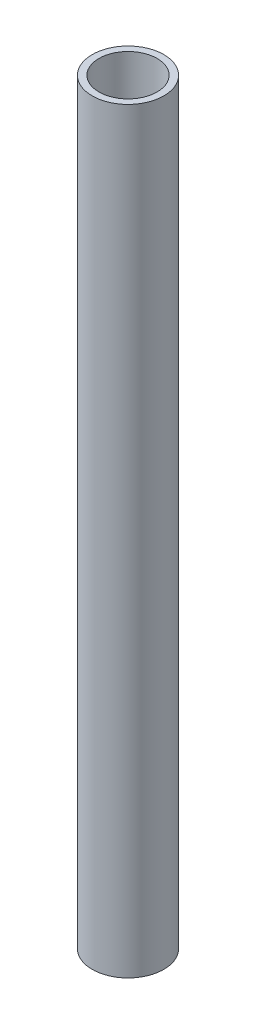
ISO-10303-21;
HEADER;
FILE_DESCRIPTION(('STEP AP214'),'2;1');
FILE_NAME('part.step','',(''),(''),'','','');
FILE_SCHEMA(('AUTOMOTIVE_DESIGN { 1 0 10303 214 1 1 1 1 }'));
ENDSEC;
DATA;
#1=APPLICATION_CONTEXT('core data for automotive mechanical design processes');
#2=APPLICATION_PROTOCOL_DEFINITION('international standard','automotive_design',2000,#1);
#3=PRODUCT_CONTEXT('',#1,'mechanical');
#4=PRODUCT('Part','Part','',(#3));
#5=PRODUCT_RELATED_PRODUCT_CATEGORY('part','',(#4));
#6=PRODUCT_DEFINITION_FORMATION('','',#4);
#7=PRODUCT_DEFINITION_CONTEXT('part definition',#1,'design');
#8=PRODUCT_DEFINITION('design','',#6,#7);
#9=PRODUCT_DEFINITION_SHAPE('','',#8);
#10=(LENGTH_UNIT() NAMED_UNIT(*) SI_UNIT(.MILLI.,.METRE.));
#11=(NAMED_UNIT(*) PLANE_ANGLE_UNIT() SI_UNIT($,.RADIAN.));
#12=(NAMED_UNIT(*) SI_UNIT($,.STERADIAN.) SOLID_ANGLE_UNIT());
#13=UNCERTAINTY_MEASURE_WITH_UNIT(LENGTH_MEASURE(1.E-05),#10,'distance_accuracy_value','');
#14=(GEOMETRIC_REPRESENTATION_CONTEXT(3) GLOBAL_UNCERTAINTY_ASSIGNED_CONTEXT((#13)) GLOBAL_UNIT_ASSIGNED_CONTEXT((#10,
#11,#12)) REPRESENTATION_CONTEXT('',''));
#15=CARTESIAN_POINT('',(0.,0.,0.));
#16=DIRECTION('',(0.,0.,1.));
#17=DIRECTION('',(1.,0.,0.));
#18=AXIS2_PLACEMENT_3D('',#15,#16,#17);
#19=CARTESIAN_POINT('',(2.44769482460327E-11,225.,1.50000000000049));
#20=DIRECTION('',(0.,1.,0.));
#21=DIRECTION('',(0.,0.,0.999999999999999));
#22=AXIS2_PLACEMENT_3D('',#19,#20,#21);
#23=PLANE('',#22);
#24=CARTESIAN_POINT('',(2.44769482460327E-11,225.,1.50000000000049));
#25=DIRECTION('',(0.,1.,0.));
#26=DIRECTION('',(0.,0.,0.999999999999999));
#27=AXIS2_PLACEMENT_3D('',#24,#25,#26);
#28=CIRCLE('',#27,10.65);
#29=CARTESIAN_POINT('',(2.44563488384369E-11,225.,-9.1499999999995));
#30=VERTEX_POINT('',#29);
#31=EDGE_CURVE('E12',#30,#30,#28,.T.);
#32=ORIENTED_EDGE('',*,*,#31,.T.);
#33=EDGE_LOOP('',(#32));
#34=FACE_BOUND('',#33,.T.);
#35=CARTESIAN_POINT('',(2.44769482460327E-11,225.,1.50000000000049));
#36=DIRECTION('',(0.,1.,0.));
#37=DIRECTION('',(0.,0.,0.999999999999999));
#38=AXIS2_PLACEMENT_3D('',#35,#36,#37);
#39=CIRCLE('',#38,8.65);
#40=CARTESIAN_POINT('',(2.44602172717883E-11,225.,-7.1499999999995));
#41=VERTEX_POINT('',#40);
#42=EDGE_CURVE('E60',#41,#41,#39,.T.);
#43=ORIENTED_EDGE('',*,*,#42,.F.);
#44=EDGE_LOOP('',(#43));
#45=FACE_BOUND('',#44,.T.);
#46=ADVANCED_FACE('F46',(#34,#45),#23,.T.);
#47=CARTESIAN_POINT('',(2.44249065417534E-11,-2.4980018054066E-13,1.49999999999982));
#48=DIRECTION('',(0.,1.,0.));
#49=DIRECTION('',(0.,0.,0.999999999999999));
#50=AXIS2_PLACEMENT_3D('',#47,#48,#49);
#51=PLANE('',#50);
#52=CARTESIAN_POINT('',(2.44249065417534E-11,-2.4980018054066E-13,1.49999999999982));
#53=DIRECTION('',(0.,1.,0.));
#54=DIRECTION('',(0.,0.,0.999999999999999));
#55=AXIS2_PLACEMENT_3D('',#52,#53,#54);
#56=CIRCLE('',#55,10.65);
#57=CARTESIAN_POINT('',(2.44024399665401E-11,-2.22044604925031E-13,-9.14999999999955));
#58=VERTEX_POINT('',#57);
#59=EDGE_CURVE('E50',#58,#58,#56,.T.);
#60=ORIENTED_EDGE('',*,*,#59,.F.);
#61=EDGE_LOOP('',(#60));
#62=FACE_BOUND('',#61,.T.);
#63=CARTESIAN_POINT('',(2.44249065417534E-11,-2.4980018054066E-13,1.49999999999982));
#64=DIRECTION('',(0.,1.,0.));
#65=DIRECTION('',(0.,0.,0.999999999999999));
#66=AXIS2_PLACEMENT_3D('',#63,#64,#65);
#67=CIRCLE('',#66,8.65);
#68=CARTESIAN_POINT('',(2.44063083998914E-11,-2.22044604925031E-13,-7.14999999999955));
#69=VERTEX_POINT('',#68);
#70=EDGE_CURVE('E62',#69,#69,#67,.T.);
#71=ORIENTED_EDGE('',*,*,#70,.T.);
#72=EDGE_LOOP('',(#71));
#73=FACE_BOUND('',#72,.T.);
#74=ADVANCED_FACE('F75',(#62,#73),#51,.F.);
#75=CARTESIAN_POINT('',(2.44769482460327E-11,225.,1.50000000000049));
#76=DIRECTION('',(0.,-1.,0.));
#77=DIRECTION('',(0.,0.,-0.999999999999999));
#78=AXIS2_PLACEMENT_3D('',#75,#76,#77);
#79=CYLINDRICAL_SURFACE('',#78,10.65);
#80=CARTESIAN_POINT('',(2.44563488384369E-11,225.,-9.1499999999995));
#81=CARTESIAN_POINT('',(2.4455787287688E-11,222.65625,-9.1499999999995));
#82=CARTESIAN_POINT('',(2.44552257369391E-11,220.3125,-9.1499999999995));
#83=CARTESIAN_POINT('',(2.44541026354412E-11,215.625,-9.1499999999995));
#84=CARTESIAN_POINT('',(2.44535410846923E-11,213.28125,-9.1499999999995));
#85=CARTESIAN_POINT('',(2.44524179831945E-11,208.59375,-9.1499999999995));
#86=CARTESIAN_POINT('',(2.44518564324455E-11,206.25,-9.1499999999995));
#87=CARTESIAN_POINT('',(2.44507333309477E-11,201.5625,-9.1499999999995));
#88=CARTESIAN_POINT('',(2.44501717801988E-11,199.21875,-9.14999999999951));
#89=CARTESIAN_POINT('',(2.44490486787009E-11,194.53125,-9.14999999999951));
#90=CARTESIAN_POINT('',(2.4448487127952E-11,192.1875,-9.14999999999951));
#91=CARTESIAN_POINT('',(2.44473640264541E-11,187.5,-9.14999999999951));
#92=CARTESIAN_POINT('',(2.44468024757052E-11,185.15625,-9.14999999999951));
#93=CARTESIAN_POINT('',(2.44456793742074E-11,180.46875,-9.14999999999951));
#94=CARTESIAN_POINT('',(2.44451178234584E-11,178.125,-9.14999999999951));
#95=CARTESIAN_POINT('',(2.44439947219606E-11,173.4375,-9.14999999999951));
#96=CARTESIAN_POINT('',(2.44434331712117E-11,171.09375,-9.14999999999951));
#97=CARTESIAN_POINT('',(2.44423100697138E-11,166.40625,-9.14999999999951));
#98=CARTESIAN_POINT('',(2.44417485189649E-11,164.0625,-9.14999999999951));
#99=CARTESIAN_POINT('',(2.4440625417467E-11,159.375,-9.14999999999951));
#100=CARTESIAN_POINT('',(2.44400638667181E-11,157.03125,-9.14999999999951));
#101=CARTESIAN_POINT('',(2.44389407652203E-11,152.34375,-9.14999999999951));
#102=CARTESIAN_POINT('',(2.44383792144713E-11,150.,-9.14999999999952));
#103=CARTESIAN_POINT('',(2.44372561129735E-11,145.3125,-9.14999999999952));
#104=CARTESIAN_POINT('',(2.44366945622246E-11,142.96875,-9.14999999999952));
#105=CARTESIAN_POINT('',(2.44355714607267E-11,138.28125,-9.14999999999952));
#106=CARTESIAN_POINT('',(2.44350099099778E-11,135.9375,-9.14999999999952));
#107=CARTESIAN_POINT('',(2.44338868084799E-11,131.25,-9.14999999999952));
#108=CARTESIAN_POINT('',(2.4433325257731E-11,128.90625,-9.14999999999952));
#109=CARTESIAN_POINT('',(2.44322021562332E-11,124.21875,-9.14999999999952));
#110=CARTESIAN_POINT('',(2.44316406054842E-11,121.875,-9.14999999999952));
#111=CARTESIAN_POINT('',(2.44305175039864E-11,117.1875,-9.14999999999952));
#112=CARTESIAN_POINT('',(2.44299559532375E-11,114.84375,-9.14999999999952));
#113=CARTESIAN_POINT('',(2.44288328517396E-11,110.15625,-9.14999999999952));
#114=CARTESIAN_POINT('',(2.44282713009907E-11,107.8125,-9.14999999999952));
#115=CARTESIAN_POINT('',(2.44271481994928E-11,103.125,-9.14999999999952));
#116=CARTESIAN_POINT('',(2.44265866487439E-11,100.78125,-9.14999999999953));
#117=CARTESIAN_POINT('',(2.44254635472461E-11,96.0937499999997,-9.14999999999953));
#118=CARTESIAN_POINT('',(2.44249019964971E-11,93.7499999999997,-9.14999999999953));
#119=CARTESIAN_POINT('',(2.44237788949993E-11,89.0624999999997,-9.14999999999953));
#120=CARTESIAN_POINT('',(2.44232173442503E-11,86.7187499999997,-9.14999999999953));
#121=CARTESIAN_POINT('',(2.44220942427525E-11,82.0312499999997,-9.14999999999953));
#122=CARTESIAN_POINT('',(2.44215326920036E-11,79.6874999999997,-9.14999999999953));
#123=CARTESIAN_POINT('',(2.44204095905057E-11,74.9999999999997,-9.14999999999953));
#124=CARTESIAN_POINT('',(2.44198480397568E-11,72.6562499999997,-9.14999999999953));
#125=CARTESIAN_POINT('',(2.44187249382589E-11,67.9687499999997,-9.14999999999953));
#126=CARTESIAN_POINT('',(2.441816338751E-11,65.6249999999997,-9.14999999999953));
#127=CARTESIAN_POINT('',(2.44170402860122E-11,60.9374999999997,-9.14999999999953));
#128=CARTESIAN_POINT('',(2.44164787352632E-11,58.5937499999997,-9.14999999999954));
#129=CARTESIAN_POINT('',(2.44153556337654E-11,53.9062499999997,-9.14999999999954));
#130=CARTESIAN_POINT('',(2.44147940830165E-11,51.5624999999998,-9.14999999999954));
#131=CARTESIAN_POINT('',(2.44136709815186E-11,46.8749999999998,-9.14999999999954));
#132=CARTESIAN_POINT('',(2.44131094307697E-11,44.5312499999998,-9.14999999999954));
#133=CARTESIAN_POINT('',(2.44119863292718E-11,39.8437499999998,-9.14999999999954));
#134=CARTESIAN_POINT('',(2.44114247785229E-11,37.4999999999998,-9.14999999999954));
#135=CARTESIAN_POINT('',(2.44103016770251E-11,32.8124999999998,-9.14999999999954));
#136=CARTESIAN_POINT('',(2.44097401262761E-11,30.4687499999998,-9.14999999999954));
#137=CARTESIAN_POINT('',(2.44086170247783E-11,25.7812499999998,-9.14999999999954));
#138=CARTESIAN_POINT('',(2.44080554740294E-11,23.4374999999998,-9.14999999999954));
#139=CARTESIAN_POINT('',(2.44069323725315E-11,18.7499999999998,-9.14999999999954));
#140=CARTESIAN_POINT('',(2.44063708217826E-11,16.4062499999998,-9.14999999999955));
#141=CARTESIAN_POINT('',(2.44052477202847E-11,11.7187499999998,-9.14999999999955));
#142=CARTESIAN_POINT('',(2.44046861695358E-11,9.37499999999976,-9.14999999999955));
#143=CARTESIAN_POINT('',(2.4403563068038E-11,4.68749999999977,-9.14999999999955));
#144=CARTESIAN_POINT('',(2.4403001517289E-11,2.34374999999978,-9.14999999999955));
#145=CARTESIAN_POINT('',(2.44024399665401E-11,-2.22044604925031E-13,-9.14999999999955));
#146=B_SPLINE_CURVE_WITH_KNOTS('',3,(#80,#81,#82,#83,#84,#85,#86,#87,#88,#89,#90,#91,#92,#93,
#94,#95,#96,#97,#98,#99,#100,#101,#102,#103,#104,#105,#106,#107,#108,#109,#110,#111,#112,#113,
#114,#115,#116,#117,#118,#119,#120,#121,#122,#123,#124,#125,#126,#127,#128,#129,#130,#131,#132,
#133,#134,#135,#136,#137,#138,#139,#140,#141,#142,#143,#144,#145),.UNSPECIFIED.,.F.,.F.,(4,2,2,
2,2,2,2,2,2,2,2,2,2,2,2,2,2,2,2,2,2,2,2,2,2,2,2,2,2,2,2,2,4),(0.,7.03124999999999,14.0625,
21.09375,28.125,35.15625,42.1875,49.21875,56.2499999999999,63.2812499999999,70.3124999999999,
77.3437499999999,84.3749999999999,91.4062499999999,98.4374999999999,105.46875,112.5,119.53125,
126.5625,133.59375,140.625,147.65625,154.6875,161.71875,168.75,175.78125,182.8125,189.84375,
196.875,203.90625,210.9375,217.96875,225.),.UNSPECIFIED.);
#147=EDGE_CURVE('BSEAM48',#30,#58,#146,.T.);
#148=ORIENTED_EDGE('',*,*,#31,.F.);
#149=ORIENTED_EDGE('',*,*,#59,.T.);
#150=ORIENTED_EDGE('',*,*,#147,.T.);
#151=ORIENTED_EDGE('',*,*,#147,.F.);
#152=EDGE_LOOP('',(#148,#150,#149,#151));
#153=FACE_BOUND('',#152,.T.);
#154=ADVANCED_FACE('F48',(#153),#79,.T.);
#155=CARTESIAN_POINT('',(2.44769482460327E-11,225.,1.50000000000049));
#156=DIRECTION('',(0.,-1.,0.));
#157=DIRECTION('',(0.,0.,-0.999999999999999));
#158=AXIS2_PLACEMENT_3D('',#155,#156,#157);
#159=CYLINDRICAL_SURFACE('',#158,8.65);
#160=CARTESIAN_POINT('',(2.44602172717883E-11,225.,-7.1499999999995));
#161=CARTESIAN_POINT('',(2.44596557210393E-11,222.65625,-7.1499999999995));
#162=CARTESIAN_POINT('',(2.44590941702904E-11,220.3125,-7.1499999999995));
#163=CARTESIAN_POINT('',(2.44579710687926E-11,215.625,-7.1499999999995));
#164=CARTESIAN_POINT('',(2.44574095180436E-11,213.28125,-7.14999999999951));
#165=CARTESIAN_POINT('',(2.44562864165458E-11,208.59375,-7.14999999999951));
#166=CARTESIAN_POINT('',(2.44557248657969E-11,206.25,-7.14999999999951));
#167=CARTESIAN_POINT('',(2.4454601764299E-11,201.5625,-7.14999999999951));
#168=CARTESIAN_POINT('',(2.44540402135501E-11,199.21875,-7.14999999999951));
#169=CARTESIAN_POINT('',(2.44529171120522E-11,194.53125,-7.14999999999951));
#170=CARTESIAN_POINT('',(2.44523555613033E-11,192.1875,-7.14999999999951));
#171=CARTESIAN_POINT('',(2.44512324598055E-11,187.5,-7.14999999999951));
#172=CARTESIAN_POINT('',(2.44506709090565E-11,185.15625,-7.14999999999951));
#173=CARTESIAN_POINT('',(2.44495478075587E-11,180.46875,-7.14999999999951));
#174=CARTESIAN_POINT('',(2.44489862568098E-11,178.125,-7.14999999999951));
#175=CARTESIAN_POINT('',(2.44478631553119E-11,173.4375,-7.14999999999951));
#176=CARTESIAN_POINT('',(2.4447301604563E-11,171.09375,-7.14999999999951));
#177=CARTESIAN_POINT('',(2.44461785030651E-11,166.40625,-7.14999999999951));
#178=CARTESIAN_POINT('',(2.44456169523162E-11,164.0625,-7.14999999999952));
#179=CARTESIAN_POINT('',(2.44444938508184E-11,159.375,-7.14999999999952));
#180=CARTESIAN_POINT('',(2.44439323000694E-11,157.03125,-7.14999999999952));
#181=CARTESIAN_POINT('',(2.44428091985716E-11,152.34375,-7.14999999999952));
#182=CARTESIAN_POINT('',(2.44422476478227E-11,150.,-7.14999999999952));
#183=CARTESIAN_POINT('',(2.44411245463248E-11,145.3125,-7.14999999999952));
#184=CARTESIAN_POINT('',(2.44405629955759E-11,142.96875,-7.14999999999952));
#185=CARTESIAN_POINT('',(2.4439439894078E-11,138.28125,-7.14999999999952));
#186=CARTESIAN_POINT('',(2.44388783433291E-11,135.9375,-7.14999999999952));
#187=CARTESIAN_POINT('',(2.44377552418312E-11,131.25,-7.14999999999952));
#188=CARTESIAN_POINT('',(2.44371936910823E-11,128.90625,-7.14999999999952));
#189=CARTESIAN_POINT('',(2.44360705895845E-11,124.21875,-7.14999999999953));
#190=CARTESIAN_POINT('',(2.44355090388356E-11,121.875,-7.14999999999953));
#191=CARTESIAN_POINT('',(2.44343859373377E-11,117.1875,-7.14999999999953));
#192=CARTESIAN_POINT('',(2.44338243865888E-11,114.84375,-7.14999999999953));
#193=CARTESIAN_POINT('',(2.44327012850909E-11,110.15625,-7.14999999999953));
#194=CARTESIAN_POINT('',(2.4432139734342E-11,107.8125,-7.14999999999953));
#195=CARTESIAN_POINT('',(2.44310166328442E-11,103.125,-7.14999999999953));
#196=CARTESIAN_POINT('',(2.44304550820952E-11,100.78125,-7.14999999999953));
#197=CARTESIAN_POINT('',(2.44293319805974E-11,96.0937499999997,-7.14999999999953));
#198=CARTESIAN_POINT('',(2.44287704298484E-11,93.7499999999997,-7.14999999999953));
#199=CARTESIAN_POINT('',(2.44276473283506E-11,89.0624999999997,-7.14999999999953));
#200=CARTESIAN_POINT('',(2.44270857776017E-11,86.7187499999997,-7.14999999999953));
#201=CARTESIAN_POINT('',(2.44259626761038E-11,82.0312499999997,-7.14999999999953));
#202=CARTESIAN_POINT('',(2.44254011253549E-11,79.6874999999997,-7.14999999999953));
#203=CARTESIAN_POINT('',(2.4424278023857E-11,74.9999999999997,-7.14999999999954));
#204=CARTESIAN_POINT('',(2.44237164731081E-11,72.6562499999997,-7.14999999999954));
#205=CARTESIAN_POINT('',(2.44225933716103E-11,67.9687499999998,-7.14999999999954));
#206=CARTESIAN_POINT('',(2.44220318208613E-11,65.6249999999998,-7.14999999999954));
#207=CARTESIAN_POINT('',(2.44209087193635E-11,60.9374999999998,-7.14999999999954));
#208=CARTESIAN_POINT('',(2.44203471686146E-11,58.5937499999998,-7.14999999999954));
#209=CARTESIAN_POINT('',(2.44192240671167E-11,53.9062499999997,-7.14999999999954));
#210=CARTESIAN_POINT('',(2.44186625163678E-11,51.5624999999998,-7.14999999999954));
#211=CARTESIAN_POINT('',(2.44175394148699E-11,46.8749999999998,-7.14999999999954));
#212=CARTESIAN_POINT('',(2.4416977864121E-11,44.5312499999998,-7.14999999999954));
#213=CARTESIAN_POINT('',(2.44158547626232E-11,39.8437499999998,-7.14999999999954));
#214=CARTESIAN_POINT('',(2.44152932118742E-11,37.4999999999998,-7.14999999999954));
#215=CARTESIAN_POINT('',(2.44141701103764E-11,32.8124999999998,-7.14999999999954));
#216=CARTESIAN_POINT('',(2.44136085596275E-11,30.4687499999998,-7.14999999999955));
#217=CARTESIAN_POINT('',(2.44124854581296E-11,25.7812499999998,-7.14999999999955));
#218=CARTESIAN_POINT('',(2.44119239073807E-11,23.4374999999998,-7.14999999999955));
#219=CARTESIAN_POINT('',(2.44108008058828E-11,18.7499999999998,-7.14999999999955));
#220=CARTESIAN_POINT('',(2.44102392551339E-11,16.4062499999998,-7.14999999999955));
#221=CARTESIAN_POINT('',(2.44091161536361E-11,11.7187499999998,-7.14999999999955));
#222=CARTESIAN_POINT('',(2.44085546028871E-11,9.37499999999977,-7.14999999999955));
#223=CARTESIAN_POINT('',(2.44074315013893E-11,4.68749999999977,-7.14999999999955));
#224=CARTESIAN_POINT('',(2.44068699506404E-11,2.34374999999978,-7.14999999999955));
#225=CARTESIAN_POINT('',(2.44063083998914E-11,-2.22044604925031E-13,-7.14999999999955));
#226=B_SPLINE_CURVE_WITH_KNOTS('',3,(#160,#161,#162,#163,#164,#165,#166,#167,#168,#169,#170,
#171,#172,#173,#174,#175,#176,#177,#178,#179,#180,#181,#182,#183,#184,#185,#186,#187,#188,#189,
#190,#191,#192,#193,#194,#195,#196,#197,#198,#199,#200,#201,#202,#203,#204,#205,#206,#207,#208,
#209,#210,#211,#212,#213,#214,#215,#216,#217,#218,#219,#220,#221,#222,#223,#224,#225),
.UNSPECIFIED.,.F.,.F.,(4,2,2,2,2,2,2,2,2,2,2,2,2,2,2,2,2,2,2,2,2,2,2,2,2,2,2,2,2,2,2,2,4),(0.,
7.03125000000002,14.0625,21.09375,28.125,35.15625,42.1875,49.21875,56.25,63.28125,70.3125,
77.34375,84.375,91.40625,98.4375,105.46875,112.5,119.53125,126.5625,133.59375,140.625,147.65625,
154.6875,161.71875,168.75,175.78125,182.8125,189.84375,196.875,203.90625,210.9375,217.96875,
225.),.UNSPECIFIED.);
#227=EDGE_CURVE('BSEAM71',#41,#69,#226,.T.);
#228=ORIENTED_EDGE('',*,*,#42,.T.);
#229=ORIENTED_EDGE('',*,*,#70,.F.);
#230=ORIENTED_EDGE('',*,*,#227,.T.);
#231=ORIENTED_EDGE('',*,*,#227,.F.);
#232=EDGE_LOOP('',(#228,#230,#229,#231));
#233=FACE_BOUND('',#232,.T.);
#234=ADVANCED_FACE('F71',(#233),#159,.F.);
#235=CLOSED_SHELL('',(#46,#74,#154,#234));
#236=MANIFOLD_SOLID_BREP('B2',#235);
#237=ADVANCED_BREP_SHAPE_REPRESENTATION('',(#18,#236),#14);
#238=SHAPE_DEFINITION_REPRESENTATION(#9,#237);
ENDSEC;
END-ISO-10303-21;
